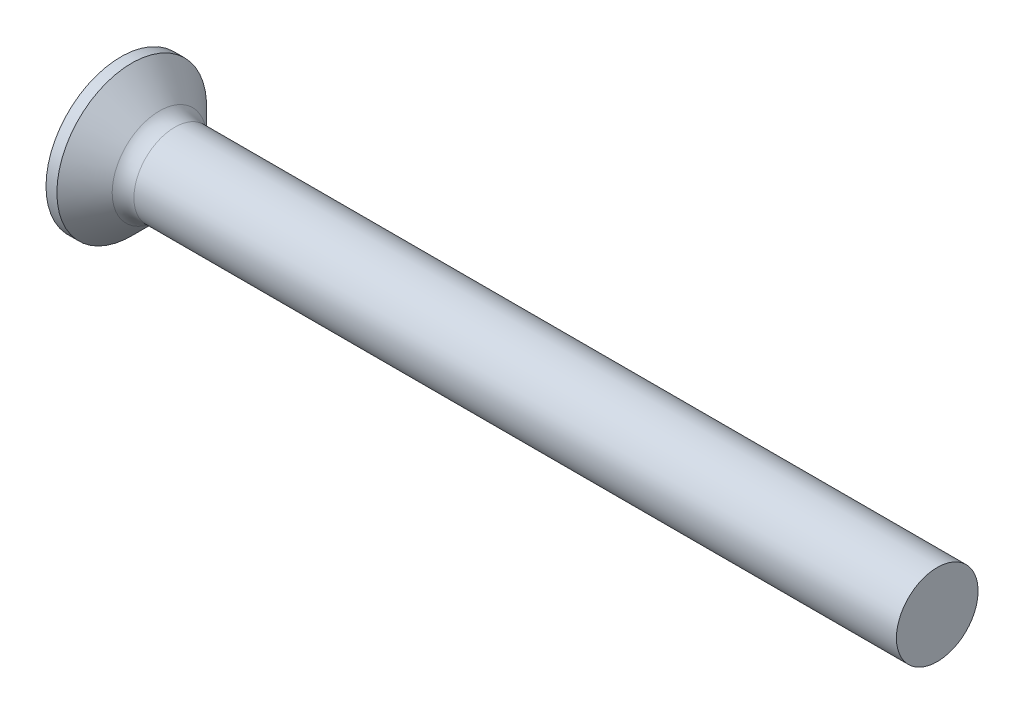
ISO-10303-21;
HEADER;
FILE_DESCRIPTION(('STEP AP214'),'2;1');
FILE_NAME('part.step','',(''),(''),'','','');
FILE_SCHEMA(('AUTOMOTIVE_DESIGN { 1 0 10303 214 1 1 1 1 }'));
ENDSEC;
DATA;
#1=APPLICATION_CONTEXT('core data for automotive mechanical design processes');
#2=APPLICATION_PROTOCOL_DEFINITION('international standard','automotive_design',2000,#1);
#3=PRODUCT_CONTEXT('',#1,'mechanical');
#4=PRODUCT('Part','Part','',(#3));
#5=PRODUCT_RELATED_PRODUCT_CATEGORY('part','',(#4));
#6=PRODUCT_DEFINITION_FORMATION('','',#4);
#7=PRODUCT_DEFINITION_CONTEXT('part definition',#1,'design');
#8=PRODUCT_DEFINITION('design','',#6,#7);
#9=PRODUCT_DEFINITION_SHAPE('','',#8);
#10=(LENGTH_UNIT() NAMED_UNIT(*) SI_UNIT(.MILLI.,.METRE.));
#11=(NAMED_UNIT(*) PLANE_ANGLE_UNIT() SI_UNIT($,.RADIAN.));
#12=(NAMED_UNIT(*) SI_UNIT($,.STERADIAN.) SOLID_ANGLE_UNIT());
#13=UNCERTAINTY_MEASURE_WITH_UNIT(LENGTH_MEASURE(1.E-05),#10,'distance_accuracy_value','');
#14=(GEOMETRIC_REPRESENTATION_CONTEXT(3) GLOBAL_UNCERTAINTY_ASSIGNED_CONTEXT((#13)) GLOBAL_UNIT_ASSIGNED_CONTEXT((#10,
#11,#12)) REPRESENTATION_CONTEXT('',''));
#15=CARTESIAN_POINT('',(0.,0.,0.));
#16=DIRECTION('',(0.,0.,1.));
#17=DIRECTION('',(1.,0.,0.));
#18=AXIS2_PLACEMENT_3D('',#15,#16,#17);
#19=CARTESIAN_POINT('',(2.01,-0.497851135403417,0.37));
#20=DIRECTION('',(0.,0.,-1.));
#21=DIRECTION('',(0.,1.,0.));
#22=AXIS2_PLACEMENT_3D('',#19,#20,#21);
#23=PLANE('',#22);
#24=DIRECTION('',(0.,-1.,0.));
#25=VECTOR('',#24,1.);
#26=CARTESIAN_POINT('',(0.,1.5,0.37));
#27=LINE('',#26,#25);
#28=CARTESIAN_POINT('',(0.,-0.590157547916263,0.37));
#29=VERTEX_POINT('',#28);
#30=CARTESIAN_POINT('',(0.,-1.5,0.37));
#31=VERTEX_POINT('',#30);
#32=EDGE_CURVE('E461',#29,#31,#27,.T.);
#33=ORIENTED_EDGE('',*,*,#32,.F.);
#34=CARTESIAN_POINT('',(-1.01053649691082,-0.672102030072118,0.37));
#35=CARTESIAN_POINT('',(-0.79970605871103,-0.655267098883947,0.37));
#36=CARTESIAN_POINT('',(-0.588886212503304,-0.638297110572311,0.37));
#37=CARTESIAN_POINT('',(-0.167272662529611,-0.603984130519828,0.37));
#38=CARTESIAN_POINT('',(0.0435210406290472,-0.586641131324258,0.37));
#39=CARTESIAN_POINT('',(0.465068838244709,-0.551479911667385,0.37));
#40=CARTESIAN_POINT('',(0.67582293271526,-0.533661691368909,0.37));
#41=CARTESIAN_POINT('',(1.09727362083221,-0.497387538872971,0.37));
#42=CARTESIAN_POINT('',(1.30797021521736,-0.478931615299089,0.37));
#43=CARTESIAN_POINT('',(1.67418894757201,-0.446067164121906,0.37));
#44=CARTESIAN_POINT('',(1.82972932585734,-0.431862501028414,0.37));
#45=CARTESIAN_POINT('',(2.14074770359484,-0.40279770973988,0.37));
#46=CARTESIAN_POINT('',(2.29622570356215,-0.38793758707517,0.37));
#47=CARTESIAN_POINT('',(2.60710169348415,-0.357305117937677,0.37));
#48=CARTESIAN_POINT('',(2.76249967840253,-0.34153271979064,0.37));
#49=CARTESIAN_POINT('',(2.99549070742189,-0.316847908281595,0.37));
#50=CARTESIAN_POINT('',(3.07313791118864,-0.308448465897182,0.37));
#51=CARTESIAN_POINT('',(3.22838341575769,-0.29120225104834,0.37));
#52=CARTESIAN_POINT('',(3.30598171599396,-0.282355473499083,0.37));
#53=CARTESIAN_POINT('',(3.38354828463398,-0.273232461289951,0.37));
#54=B_SPLINE_CURVE_WITH_KNOTS('',3,(#34,#35,#36,#37,#38,#39,#40,#41,#42,#43,#44,#45,#46,#47,#48,
#49,#50,#51,#52,#53),.UNSPECIFIED.,.F.,.F.,(4,2,2,2,2,2,2,2,2,4),(0.,0.634504777554397,
1.26902224766093,1.90353950036111,2.53804817592041,3.00661008438666,3.47516804019383,
3.94375256268972,4.17805198331268,4.41235406779909),.UNSPECIFIED.);
#55=CARTESIAN_POINT('',(2.01,-0.415013252800437,0.37));
#56=VERTEX_POINT('',#55);
#57=EDGE_CURVE('E222',#29,#56,#54,.T.);
#58=ORIENTED_EDGE('',*,*,#57,.T.);
#59=DIRECTION('',(0.,-1.,0.));
#60=VECTOR('',#59,1.);
#61=CARTESIAN_POINT('',(2.01,0.4978511354035,0.37));
#62=LINE('',#61,#60);
#63=CARTESIAN_POINT('',(2.01,-0.497851135403417,0.37));
#64=VERTEX_POINT('',#63);
#65=EDGE_CURVE('E372',#56,#64,#62,.T.);
#66=ORIENTED_EDGE('',*,*,#65,.T.);
#67=DIRECTION('',(0.894934391398435,0.446197753347451,0.));
#68=VECTOR('',#67,1.);
#69=CARTESIAN_POINT('',(0.,-1.5,0.37));
#70=LINE('',#69,#68);
#71=EDGE_CURVE('E475',#31,#64,#70,.T.);
#72=ORIENTED_EDGE('',*,*,#71,.F.);
#73=EDGE_LOOP('',(#33,#58,#66,#72));
#74=FACE_BOUND('',#73,.T.);
#75=ADVANCED_FACE('F41',(#74),#23,.T.);
#76=CARTESIAN_POINT('',(2.01,0.4978511354035,0.37));
#77=VERTEX_POINT('',#76);
#78=CARTESIAN_POINT('',(2.01,0.415013252800437,0.37));
#79=VERTEX_POINT('',#78);
#80=EDGE_CURVE('E369',#77,#79,#62,.T.);
#81=ORIENTED_EDGE('',*,*,#80,.T.);
#82=CARTESIAN_POINT('',(-1.01053649699026,0.672102030078459,0.37));
#83=CARTESIAN_POINT('',(-0.799706058781648,0.65526709888962,0.37));
#84=CARTESIAN_POINT('',(-0.588886212565099,0.638297110577309,0.37));
#85=CARTESIAN_POINT('',(-0.167272662573758,0.603984130523453,0.37));
#86=CARTESIAN_POINT('',(0.043521040593722,0.586641131327185,0.37));
#87=CARTESIAN_POINT('',(0.465068838236453,0.551479911668094,0.37));
#88=CARTESIAN_POINT('',(0.675822932725248,0.533661691368078,0.37));
#89=CARTESIAN_POINT('',(1.09727362087867,0.497387538868943,0.37));
#90=CARTESIAN_POINT('',(1.30797021528206,0.478931615293404,0.37));
#91=CARTESIAN_POINT('',(1.67418894765493,0.446067164114376,0.37));
#92=CARTESIAN_POINT('',(1.82972932594025,0.431862501020785,0.37));
#93=CARTESIAN_POINT('',(2.14074770367772,0.402797709732016,0.37));
#94=CARTESIAN_POINT('',(2.29622570364503,0.38793758706717,0.37));
#95=CARTESIAN_POINT('',(2.60710169356699,0.357305117929346,0.37));
#96=CARTESIAN_POINT('',(2.76249967848536,0.341532719782116,0.37));
#97=CARTESIAN_POINT('',(2.99549070750468,0.316847908272698,0.37));
#98=CARTESIAN_POINT('',(3.07313791127142,0.308448465888148,0.37));
#99=CARTESIAN_POINT('',(3.22838341584044,0.291202251038989,0.37));
#100=CARTESIAN_POINT('',(3.30598171607669,0.282355473489554,0.37));
#101=CARTESIAN_POINT('',(3.38354828471668,0.273232461280216,0.37));
#102=B_SPLINE_CURVE_WITH_KNOTS('',3,(#82,#83,#84,#85,#86,#87,#88,#89,#90,#91,#92,#93,#94,#95,
#96,#97,#98,#99,#100,#101),.UNSPECIFIED.,.F.,.F.,(4,2,2,2,2,2,2,2,2,4),(0.,0.634504777580945,
1.26902224771403,1.90353950046914,2.53804817608336,3.00661008454961,3.47516804035678,
3.94375256285268,4.17805198347564,4.41235406796206),.UNSPECIFIED.);
#103=CARTESIAN_POINT('',(0.,0.590157547916263,0.37));
#104=VERTEX_POINT('',#103);
#105=EDGE_CURVE('E214',#79,#104,#102,.F.);
#106=ORIENTED_EDGE('',*,*,#105,.T.);
#107=CARTESIAN_POINT('',(0.,1.5,0.37));
#108=VERTEX_POINT('',#107);
#109=EDGE_CURVE('E467',#108,#104,#27,.T.);
#110=ORIENTED_EDGE('',*,*,#109,.F.);
#111=DIRECTION('',(0.89493439139845,-0.446197753347421,0.));
#112=VECTOR('',#111,1.);
#113=CARTESIAN_POINT('',(0.,1.5,0.37));
#114=LINE('',#113,#112);
#115=EDGE_CURVE('E64',#108,#77,#114,.T.);
#116=ORIENTED_EDGE('',*,*,#115,.T.);
#117=EDGE_LOOP('',(#81,#106,#110,#116));
#118=FACE_BOUND('',#117,.T.);
#119=ADVANCED_FACE('F191',(#118),#23,.T.);
#120=CARTESIAN_POINT('',(2.01,0.4978511354035,-0.37));
#121=DIRECTION('',(0.,0.,1.));
#122=DIRECTION('',(1.,0.,0.));
#123=AXIS2_PLACEMENT_3D('',#120,#121,#122);
#124=PLANE('',#123);
#125=DIRECTION('',(0.,1.,0.));
#126=VECTOR('',#125,1.);
#127=CARTESIAN_POINT('',(2.01,-0.497851135403417,-0.37));
#128=LINE('',#127,#126);
#129=CARTESIAN_POINT('',(2.01,-0.497851135403417,-0.37));
#130=VERTEX_POINT('',#129);
#131=CARTESIAN_POINT('',(2.01,-0.415013252800437,-0.37));
#132=VERTEX_POINT('',#131);
#133=EDGE_CURVE('E384',#130,#132,#128,.T.);
#134=ORIENTED_EDGE('',*,*,#133,.T.);
#135=CARTESIAN_POINT('',(-1.01053649691082,-0.672102030072118,-0.37));
#136=CARTESIAN_POINT('',(-0.79970605871103,-0.655267098883947,-0.37));
#137=CARTESIAN_POINT('',(-0.588886212503305,-0.638297110572311,-0.37));
#138=CARTESIAN_POINT('',(-0.16727266252961,-0.603984130519828,-0.37));
#139=CARTESIAN_POINT('',(0.0435210406290472,-0.586641131324259,-0.37));
#140=CARTESIAN_POINT('',(0.465068838244709,-0.551479911667385,-0.37));
#141=CARTESIAN_POINT('',(0.67582293271526,-0.533661691368909,-0.37));
#142=CARTESIAN_POINT('',(1.09727362083221,-0.497387538872971,-0.37));
#143=CARTESIAN_POINT('',(1.30797021521736,-0.47893161529909,-0.37));
#144=CARTESIAN_POINT('',(1.67418894757201,-0.446067164121906,-0.37));
#145=CARTESIAN_POINT('',(1.82972932585734,-0.431862501028414,-0.37));
#146=CARTESIAN_POINT('',(2.14074770359484,-0.40279770973988,-0.37));
#147=CARTESIAN_POINT('',(2.29622570356215,-0.38793758707517,-0.37));
#148=CARTESIAN_POINT('',(2.60710169348415,-0.357305117937677,-0.37));
#149=CARTESIAN_POINT('',(2.76249967840254,-0.34153271979064,-0.37));
#150=CARTESIAN_POINT('',(2.99549070742189,-0.316847908281595,-0.37));
#151=CARTESIAN_POINT('',(3.07313791118864,-0.308448465897182,-0.37));
#152=CARTESIAN_POINT('',(3.22838341575769,-0.29120225104834,-0.37));
#153=CARTESIAN_POINT('',(3.30598171599396,-0.282355473499083,-0.37));
#154=CARTESIAN_POINT('',(3.38354828463398,-0.273232461289951,-0.37));
#155=B_SPLINE_CURVE_WITH_KNOTS('',3,(#135,#136,#137,#138,#139,#140,#141,#142,#143,#144,#145,
#146,#147,#148,#149,#150,#151,#152,#153,#154),.UNSPECIFIED.,.F.,.F.,(4,2,2,2,2,2,2,2,2,4),(0.,
0.634504777554397,1.26902224766093,1.90353950036111,2.53804817592041,3.00661008438666,
3.47516804019383,3.94375256268973,4.17805198331268,4.41235406779909),.UNSPECIFIED.);
#156=CARTESIAN_POINT('',(0.,-0.590157547916263,-0.37));
#157=VERTEX_POINT('',#156);
#158=EDGE_CURVE('E280',#132,#157,#155,.F.);
#159=ORIENTED_EDGE('',*,*,#158,.T.);
#160=DIRECTION('',(0.,1.,0.));
#161=VECTOR('',#160,1.);
#162=CARTESIAN_POINT('',(0.,-1.5,-0.37));
#163=LINE('',#162,#161);
#164=CARTESIAN_POINT('',(0.,-1.5,-0.37));
#165=VERTEX_POINT('',#164);
#166=EDGE_CURVE('E463',#165,#157,#163,.T.);
#167=ORIENTED_EDGE('',*,*,#166,.F.);
#168=DIRECTION('',(0.894934391398435,0.446197753347451,0.));
#169=VECTOR('',#168,1.);
#170=CARTESIAN_POINT('',(0.,-1.5,-0.37));
#171=LINE('',#170,#169);
#172=EDGE_CURVE('E471',#165,#130,#171,.T.);
#173=ORIENTED_EDGE('',*,*,#172,.T.);
#174=EDGE_LOOP('',(#134,#159,#167,#173));
#175=FACE_BOUND('',#174,.T.);
#176=ADVANCED_FACE('F205',(#175),#124,.T.);
#177=CARTESIAN_POINT('',(0.,0.590157547916263,-0.37));
#178=VERTEX_POINT('',#177);
#179=CARTESIAN_POINT('',(0.,1.5,-0.37));
#180=VERTEX_POINT('',#179);
#181=EDGE_CURVE('E472',#178,#180,#163,.T.);
#182=ORIENTED_EDGE('',*,*,#181,.F.);
#183=CARTESIAN_POINT('',(-1.01053649691082,0.672102030072118,-0.37));
#184=CARTESIAN_POINT('',(-0.79970605871103,0.655267098883947,-0.37));
#185=CARTESIAN_POINT('',(-0.588886212503304,0.638297110572311,-0.37));
#186=CARTESIAN_POINT('',(-0.16727266252961,0.603984130519828,-0.37));
#187=CARTESIAN_POINT('',(0.0435210406290473,0.586641131324259,-0.37));
#188=CARTESIAN_POINT('',(0.465068838244709,0.551479911667385,-0.37));
#189=CARTESIAN_POINT('',(0.67582293271526,0.533661691368909,-0.37));
#190=CARTESIAN_POINT('',(1.09727362083221,0.497387538872971,-0.37));
#191=CARTESIAN_POINT('',(1.30797021521736,0.478931615299089,-0.37));
#192=CARTESIAN_POINT('',(1.67418894757201,0.446067164121906,-0.37));
#193=CARTESIAN_POINT('',(1.82972932585734,0.431862501028415,-0.37));
#194=CARTESIAN_POINT('',(2.14074770359484,0.40279770973988,-0.37));
#195=CARTESIAN_POINT('',(2.29622570356215,0.38793758707517,-0.37));
#196=CARTESIAN_POINT('',(2.60710169348415,0.357305117937677,-0.37));
#197=CARTESIAN_POINT('',(2.76249967840253,0.34153271979064,-0.37));
#198=CARTESIAN_POINT('',(2.99549070742189,0.316847908281595,-0.37));
#199=CARTESIAN_POINT('',(3.07313791118864,0.308448465897183,-0.37));
#200=CARTESIAN_POINT('',(3.22838341575769,0.29120225104834,-0.37));
#201=CARTESIAN_POINT('',(3.30598171599396,0.282355473499083,-0.37));
#202=CARTESIAN_POINT('',(3.38354828463398,0.273232461289951,-0.37));
#203=B_SPLINE_CURVE_WITH_KNOTS('',3,(#183,#184,#185,#186,#187,#188,#189,#190,#191,#192,#193,
#194,#195,#196,#197,#198,#199,#200,#201,#202),.UNSPECIFIED.,.F.,.F.,(4,2,2,2,2,2,2,2,2,4),(0.,
0.634504777554397,1.26902224766093,1.90353950036111,2.53804817592041,3.00661008438666,
3.47516804019383,3.94375256268972,4.17805198331267,4.41235406779909),.UNSPECIFIED.);
#204=CARTESIAN_POINT('',(2.01,0.415013252800437,-0.37));
#205=VERTEX_POINT('',#204);
#206=EDGE_CURVE('E272',#178,#205,#203,.T.);
#207=ORIENTED_EDGE('',*,*,#206,.T.);
#208=CARTESIAN_POINT('',(2.01,0.4978511354035,-0.37));
#209=VERTEX_POINT('',#208);
#210=EDGE_CURVE('E383',#205,#209,#128,.T.);
#211=ORIENTED_EDGE('',*,*,#210,.T.);
#212=DIRECTION('',(0.89493439139845,-0.446197753347421,0.));
#213=VECTOR('',#212,1.);
#214=CARTESIAN_POINT('',(0.,1.5,-0.37));
#215=LINE('',#214,#213);
#216=EDGE_CURVE('E385',#180,#209,#215,.T.);
#217=ORIENTED_EDGE('',*,*,#216,.F.);
#218=EDGE_LOOP('',(#182,#207,#211,#217));
#219=FACE_BOUND('',#218,.T.);
#220=ADVANCED_FACE('F485',(#219),#124,.T.);
#221=CARTESIAN_POINT('',(2.01,0.4978511354035,-0.37));
#222=DIRECTION('',(1.,0.,0.));
#223=DIRECTION('',(0.,0.,-1.));
#224=AXIS2_PLACEMENT_3D('',#221,#222,#223);
#225=PLANE('',#224);
#226=CARTESIAN_POINT('',(2.01,0.,0.));
#227=DIRECTION('',(-1.,0.,0.));
#228=DIRECTION('',(0.,0.,1.));
#229=AXIS2_PLACEMENT_3D('',#226,#227,#228);
#230=CIRCLE('',#229,0.555999999999999);
#231=CARTESIAN_POINT('',(2.01,-0.247548473995554,-0.497851135403418));
#232=VERTEX_POINT('',#231);
#233=CARTESIAN_POINT('',(2.01,-0.369999999999999,-0.415013252800438));
#234=VERTEX_POINT('',#233);
#235=EDGE_CURVE('E346',#232,#234,#230,.T.);
#236=ORIENTED_EDGE('',*,*,#235,.F.);
#237=DIRECTION('',(0.,1.,0.));
#238=VECTOR('',#237,1.);
#239=CARTESIAN_POINT('',(2.01,-0.369999999999998,-0.497851135403418));
#240=LINE('',#239,#238);
#241=CARTESIAN_POINT('',(2.01,-0.369999999999998,-0.497851135403418));
#242=VERTEX_POINT('',#241);
#243=EDGE_CURVE('E446',#242,#232,#240,.T.);
#244=ORIENTED_EDGE('',*,*,#243,.F.);
#245=DIRECTION('',(0.,0.,-1.));
#246=VECTOR('',#245,1.);
#247=CARTESIAN_POINT('',(2.01,-0.370000000000002,0.497851135403499));
#248=LINE('',#247,#246);
#249=EDGE_CURVE('E453',#234,#242,#248,.T.);
#250=ORIENTED_EDGE('',*,*,#249,.F.);
#251=EDGE_LOOP('',(#236,#244,#250));
#252=FACE_BOUND('',#251,.T.);
#253=ADVANCED_FACE('F492',(#252),#225,.F.);
#254=CARTESIAN_POINT('',(2.01,-0.497851135403417,-0.247548473995555));
#255=VERTEX_POINT('',#254);
#256=EDGE_CURVE('E344',#132,#255,#230,.T.);
#257=ORIENTED_EDGE('',*,*,#256,.F.);
#258=ORIENTED_EDGE('',*,*,#133,.F.);
#259=DIRECTION('',(0.,0.,-1.));
#260=VECTOR('',#259,1.);
#261=CARTESIAN_POINT('',(2.01,-0.497851135403417,0.37));
#262=LINE('',#261,#260);
#263=EDGE_CURVE('E373',#255,#130,#262,.T.);
#264=ORIENTED_EDGE('',*,*,#263,.F.);
#265=EDGE_LOOP('',(#257,#258,#264));
#266=FACE_BOUND('',#265,.T.);
#267=ADVANCED_FACE('F501',(#266),#225,.F.);
#268=CARTESIAN_POINT('',(2.01,-0.497851135403417,0.247548473995555));
#269=VERTEX_POINT('',#268);
#270=EDGE_CURVE('E339',#269,#56,#230,.T.);
#271=ORIENTED_EDGE('',*,*,#270,.F.);
#272=EDGE_CURVE('E376',#64,#269,#262,.T.);
#273=ORIENTED_EDGE('',*,*,#272,.F.);
#274=ORIENTED_EDGE('',*,*,#65,.F.);
#275=EDGE_LOOP('',(#271,#273,#274));
#276=FACE_BOUND('',#275,.T.);
#277=ADVANCED_FACE('F510',(#276),#225,.F.);
#278=CARTESIAN_POINT('',(2.01,-0.370000000000001,0.415013252800436));
#279=VERTEX_POINT('',#278);
#280=CARTESIAN_POINT('',(2.01,-0.24754847399539,0.497851135403499));
#281=VERTEX_POINT('',#280);
#282=EDGE_CURVE('E57',#279,#281,#230,.T.);
#283=ORIENTED_EDGE('',*,*,#282,.F.);
#284=CARTESIAN_POINT('',(2.01,-0.370000000000002,0.497851135403499));
#285=VERTEX_POINT('',#284);
#286=EDGE_CURVE('E451',#285,#279,#248,.T.);
#287=ORIENTED_EDGE('',*,*,#286,.F.);
#288=DIRECTION('',(0.,-1.,0.));
#289=VECTOR('',#288,1.);
#290=CARTESIAN_POINT('',(2.01,0.369999999999998,0.497851135403501));
#291=LINE('',#290,#289);
#292=EDGE_CURVE('E454',#281,#285,#291,.T.);
#293=ORIENTED_EDGE('',*,*,#292,.F.);
#294=EDGE_LOOP('',(#283,#287,#293));
#295=FACE_BOUND('',#294,.T.);
#296=ADVANCED_FACE('F534',(#295),#225,.F.);
#297=CARTESIAN_POINT('',(2.01,0.247548473995386,0.497851135403501));
#298=VERTEX_POINT('',#297);
#299=CARTESIAN_POINT('',(2.01,0.369999999999999,0.415013252800438));
#300=VERTEX_POINT('',#299);
#301=EDGE_CURVE('E328',#298,#300,#230,.T.);
#302=ORIENTED_EDGE('',*,*,#301,.F.);
#303=CARTESIAN_POINT('',(2.01,0.369999999999998,0.497851135403501));
#304=VERTEX_POINT('',#303);
#305=EDGE_CURVE('E448',#304,#298,#291,.T.);
#306=ORIENTED_EDGE('',*,*,#305,.F.);
#307=DIRECTION('',(0.,0.,1.));
#308=VECTOR('',#307,1.);
#309=CARTESIAN_POINT('',(2.01,0.370000000000002,-0.497851135403416));
#310=LINE('',#309,#308);
#311=EDGE_CURVE('E226',#300,#304,#310,.T.);
#312=ORIENTED_EDGE('',*,*,#311,.F.);
#313=EDGE_LOOP('',(#302,#306,#312));
#314=FACE_BOUND('',#313,.T.);
#315=ADVANCED_FACE('F493',(#314),#225,.F.);
#316=CARTESIAN_POINT('',(2.01,0.4978511354035,0.247548473995388));
#317=VERTEX_POINT('',#316);
#318=EDGE_CURVE('E340',#79,#317,#230,.T.);
#319=ORIENTED_EDGE('',*,*,#318,.F.);
#320=ORIENTED_EDGE('',*,*,#80,.F.);
#321=DIRECTION('',(0.,0.,1.));
#322=VECTOR('',#321,1.);
#323=CARTESIAN_POINT('',(2.01,0.4978511354035,-0.37));
#324=LINE('',#323,#322);
#325=EDGE_CURVE('E371',#317,#77,#324,.T.);
#326=ORIENTED_EDGE('',*,*,#325,.F.);
#327=EDGE_LOOP('',(#319,#320,#326));
#328=FACE_BOUND('',#327,.T.);
#329=ADVANCED_FACE('F367',(#328),#225,.F.);
#330=CARTESIAN_POINT('',(2.01,0.4978511354035,-0.247548473995388));
#331=VERTEX_POINT('',#330);
#332=EDGE_CURVE('E360',#331,#205,#230,.T.);
#333=ORIENTED_EDGE('',*,*,#332,.F.);
#334=EDGE_CURVE('E377',#209,#331,#324,.T.);
#335=ORIENTED_EDGE('',*,*,#334,.F.);
#336=ORIENTED_EDGE('',*,*,#210,.F.);
#337=EDGE_LOOP('',(#333,#335,#336));
#338=FACE_BOUND('',#337,.T.);
#339=ADVANCED_FACE('F481',(#338),#225,.F.);
#340=CARTESIAN_POINT('',(2.01,-0.497851135403417,-0.37));
#341=DIRECTION('',(-0.446197753347451,0.894934391398435,0.));
#342=DIRECTION('',(-0.894934391398435,-0.446197753347451,0.));
#343=AXIS2_PLACEMENT_3D('',#340,#341,#342);
#344=PLANE('',#343);
#345=ORIENTED_EDGE('',*,*,#272,.T.);
#346=CARTESIAN_POINT('',(2.86902919914407,-0.0695550475538948,0.));
#347=DIRECTION('',(-0.446197753347451,0.894934391398435,0.));
#348=DIRECTION('',(-0.894934391398435,-0.446197753347451,0.));
#349=AXIS2_PLACEMENT_3D('',#346,#347,#348);
#350=ELLIPSE('',#349,1.11145971268775,0.491029001453367);
#351=EDGE_CURVE('E286',#269,#255,#350,.F.);
#352=ORIENTED_EDGE('',*,*,#351,.T.);
#353=ORIENTED_EDGE('',*,*,#263,.T.);
#354=ORIENTED_EDGE('',*,*,#172,.F.);
#355=DIRECTION('',(0.,0.,-1.));
#356=VECTOR('',#355,1.);
#357=CARTESIAN_POINT('',(0.,-1.5,0.37));
#358=LINE('',#357,#356);
#359=EDGE_CURVE('E386',#31,#165,#358,.T.);
#360=ORIENTED_EDGE('',*,*,#359,.F.);
#361=ORIENTED_EDGE('',*,*,#71,.T.);
#362=EDGE_LOOP('',(#345,#352,#353,#354,#360,#361));
#363=FACE_BOUND('',#362,.T.);
#364=ADVANCED_FACE('F206',(#363),#344,.T.);
#365=CARTESIAN_POINT('',(2.01,0.4978511354035,0.37));
#366=DIRECTION('',(-0.446197753347421,-0.89493439139845,0.));
#367=DIRECTION('',(0.89493439139845,-0.446197753347421,0.));
#368=AXIS2_PLACEMENT_3D('',#365,#366,#367);
#369=PLANE('',#368);
#370=ORIENTED_EDGE('',*,*,#334,.T.);
#371=CARTESIAN_POINT('',(2.8690291991443,0.069555047553898,0.));
#372=DIRECTION('',(-0.446197753347421,-0.89493439139845,0.));
#373=DIRECTION('',(-0.89493439139845,0.446197753347421,0.));
#374=AXIS2_PLACEMENT_3D('',#371,#372,#373);
#375=ELLIPSE('',#374,1.11145971268778,0.49102900145335);
#376=EDGE_CURVE('E295',#331,#317,#375,.F.);
#377=ORIENTED_EDGE('',*,*,#376,.T.);
#378=ORIENTED_EDGE('',*,*,#325,.T.);
#379=ORIENTED_EDGE('',*,*,#115,.F.);
#380=DIRECTION('',(0.,0.,1.));
#381=VECTOR('',#380,1.);
#382=CARTESIAN_POINT('',(0.,1.5,-0.37));
#383=LINE('',#382,#381);
#384=EDGE_CURVE('E462',#180,#108,#383,.T.);
#385=ORIENTED_EDGE('',*,*,#384,.F.);
#386=ORIENTED_EDGE('',*,*,#216,.T.);
#387=EDGE_LOOP('',(#370,#377,#378,#379,#385,#386));
#388=FACE_BOUND('',#387,.T.);
#389=ADVANCED_FACE('F478',(#388),#369,.T.);
#390=CARTESIAN_POINT('',(2.01,0.369999999999998,0.497851135403501));
#391=DIRECTION('',(0.,-1.,0.));
#392=DIRECTION('',(1.,0.,0.));
#393=AXIS2_PLACEMENT_3D('',#390,#391,#392);
#394=PLANE('',#393);
#395=CARTESIAN_POINT('',(2.01,0.370000000000002,-0.497851135403416));
#396=VERTEX_POINT('',#395);
#397=CARTESIAN_POINT('',(2.01,0.370000000000001,-0.415013252800436));
#398=VERTEX_POINT('',#397);
#399=EDGE_CURVE('E456',#396,#398,#310,.T.);
#400=ORIENTED_EDGE('',*,*,#399,.T.);
#401=CARTESIAN_POINT('',(-1.01053649699026,0.370000000000002,-0.672102030078458));
#402=CARTESIAN_POINT('',(-0.799706058781648,0.370000000000002,-0.655267098889619));
#403=CARTESIAN_POINT('',(-0.588886212565099,0.370000000000002,-0.638297110577308));
#404=CARTESIAN_POINT('',(-0.167272662573758,0.370000000000002,-0.603984130523452));
#405=CARTESIAN_POINT('',(0.0435210405937218,0.370000000000002,-0.586641131327184));
#406=CARTESIAN_POINT('',(0.465068838236452,0.370000000000002,-0.551479911668093));
#407=CARTESIAN_POINT('',(0.675822932725247,0.370000000000002,-0.533661691368077));
#408=CARTESIAN_POINT('',(1.09727362087867,0.370000000000002,-0.497387538868942));
#409=CARTESIAN_POINT('',(1.30797021528206,0.370000000000002,-0.478931615293403));
#410=CARTESIAN_POINT('',(1.67418894765493,0.370000000000001,-0.446067164114375));
#411=CARTESIAN_POINT('',(1.82972932594025,0.370000000000001,-0.431862501020784));
#412=CARTESIAN_POINT('',(2.14074770367772,0.370000000000001,-0.402797709732014));
#413=CARTESIAN_POINT('',(2.29622570364503,0.370000000000001,-0.387937587067169));
#414=CARTESIAN_POINT('',(2.60710169356699,0.370000000000001,-0.357305117929345));
#415=CARTESIAN_POINT('',(2.76249967848536,0.370000000000001,-0.341532719782114));
#416=CARTESIAN_POINT('',(2.99549070750468,0.370000000000001,-0.316847908272697));
#417=CARTESIAN_POINT('',(3.07313791127142,0.370000000000001,-0.308448465888147));
#418=CARTESIAN_POINT('',(3.22838341584044,0.370000000000001,-0.291202251038988));
#419=CARTESIAN_POINT('',(3.30598171607669,0.370000000000001,-0.282355473489552));
#420=CARTESIAN_POINT('',(3.38354828471668,0.370000000000001,-0.273232461280215));
#421=B_SPLINE_CURVE_WITH_KNOTS('',3,(#401,#402,#403,#404,#405,#406,#407,#408,#409,#410,#411,
#412,#413,#414,#415,#416,#417,#418,#419,#420),.UNSPECIFIED.,.F.,.F.,(4,2,2,2,2,2,2,2,2,4),(0.,
0.634504777580945,1.26902224771403,1.90353950046914,2.53804817608336,3.00661008454961,
3.47516804035678,3.94375256285268,4.17805198347564,4.41235406796206),.UNSPECIFIED.);
#422=CARTESIAN_POINT('',(0.,0.370000000000002,-0.590157547916262));
#423=VERTEX_POINT('',#422);
#424=EDGE_CURVE('E264',#398,#423,#421,.F.);
#425=ORIENTED_EDGE('',*,*,#424,.T.);
#426=DIRECTION('',(0.,0.,1.));
#427=VECTOR('',#426,1.);
#428=CARTESIAN_POINT('',(0.,0.370000000000005,-1.5));
#429=LINE('',#428,#427);
#430=CARTESIAN_POINT('',(0.,0.370000000000005,-1.5));
#431=VERTEX_POINT('',#430);
#432=EDGE_CURVE('E434',#431,#423,#429,.T.);
#433=ORIENTED_EDGE('',*,*,#432,.F.);
#434=DIRECTION('',(0.894934391398435,0.,0.446197753347451));
#435=VECTOR('',#434,1.);
#436=CARTESIAN_POINT('',(0.,0.370000000000005,-1.5));
#437=LINE('',#436,#435);
#438=EDGE_CURVE('E441',#431,#396,#437,.T.);
#439=ORIENTED_EDGE('',*,*,#438,.T.);
#440=EDGE_LOOP('',(#400,#425,#433,#439));
#441=FACE_BOUND('',#440,.T.);
#442=ADVANCED_FACE('F613',(#441),#394,.T.);
#443=CARTESIAN_POINT('',(2.01,-0.369999999999998,-0.497851135403418));
#444=DIRECTION('',(0.,1.,0.));
#445=DIRECTION('',(0.,0.,1.));
#446=AXIS2_PLACEMENT_3D('',#443,#444,#445);
#447=PLANE('',#446);
#448=DIRECTION('',(0.,0.,-1.));
#449=VECTOR('',#448,1.);
#450=CARTESIAN_POINT('',(0.,-0.370000000000005,1.5));
#451=LINE('',#450,#449);
#452=CARTESIAN_POINT('',(0.,-0.369999999999998,-0.590157547916264));
#453=VERTEX_POINT('',#452);
#454=CARTESIAN_POINT('',(0.,-0.369999999999995,-1.5));
#455=VERTEX_POINT('',#454);
#456=EDGE_CURVE('E431',#453,#455,#451,.T.);
#457=ORIENTED_EDGE('',*,*,#456,.F.);
#458=CARTESIAN_POINT('',(-1.01053649699026,-0.369999999999998,-0.67210203007846));
#459=CARTESIAN_POINT('',(-0.799706058781648,-0.369999999999998,-0.655267098889622));
#460=CARTESIAN_POINT('',(-0.588886212565099,-0.369999999999998,-0.638297110577311));
#461=CARTESIAN_POINT('',(-0.167272662573759,-0.369999999999998,-0.603984130523454));
#462=CARTESIAN_POINT('',(0.0435210405937218,-0.369999999999998,-0.586641131327186));
#463=CARTESIAN_POINT('',(0.465068838236453,-0.369999999999998,-0.551479911668095));
#464=CARTESIAN_POINT('',(0.675822932725248,-0.369999999999998,-0.53366169136808));
#465=CARTESIAN_POINT('',(1.09727362087867,-0.369999999999998,-0.497387538868944));
#466=CARTESIAN_POINT('',(1.30797021528206,-0.369999999999998,-0.478931615293405));
#467=CARTESIAN_POINT('',(1.67418894765493,-0.369999999999999,-0.446067164114377));
#468=CARTESIAN_POINT('',(1.82972932594025,-0.369999999999999,-0.431862501020786));
#469=CARTESIAN_POINT('',(2.14074770367772,-0.369999999999999,-0.402797709732017));
#470=CARTESIAN_POINT('',(2.29622570364503,-0.369999999999999,-0.387937587067171));
#471=CARTESIAN_POINT('',(2.60710169356699,-0.369999999999999,-0.357305117929348));
#472=CARTESIAN_POINT('',(2.76249967848536,-0.369999999999999,-0.341532719782117));
#473=CARTESIAN_POINT('',(2.99549070750468,-0.369999999999999,-0.316847908272699));
#474=CARTESIAN_POINT('',(3.07313791127142,-0.369999999999999,-0.30844846588815));
#475=CARTESIAN_POINT('',(3.22838341584044,-0.369999999999999,-0.291202251038991));
#476=CARTESIAN_POINT('',(3.30598171607669,-0.369999999999999,-0.282355473489555));
#477=CARTESIAN_POINT('',(3.38354828471668,-0.369999999999999,-0.273232461280217));
#478=B_SPLINE_CURVE_WITH_KNOTS('',3,(#458,#459,#460,#461,#462,#463,#464,#465,#466,#467,#468,
#469,#470,#471,#472,#473,#474,#475,#476,#477),.UNSPECIFIED.,.F.,.F.,(4,2,2,2,2,2,2,2,2,4),(0.,
0.634504777580943,1.26902224771403,1.90353950046914,2.53804817608336,3.00661008454961,
3.47516804035678,3.94375256285268,4.17805198347564,4.41235406796206),.UNSPECIFIED.);
#479=EDGE_CURVE('E257',#453,#234,#478,.T.);
#480=ORIENTED_EDGE('',*,*,#479,.T.);
#481=ORIENTED_EDGE('',*,*,#249,.T.);
#482=DIRECTION('',(0.894934391398435,0.,0.446197753347451));
#483=VECTOR('',#482,1.);
#484=CARTESIAN_POINT('',(0.,-0.369999999999995,-1.5));
#485=LINE('',#484,#483);
#486=EDGE_CURVE('E438',#455,#242,#485,.T.);
#487=ORIENTED_EDGE('',*,*,#486,.F.);
#488=EDGE_LOOP('',(#457,#480,#481,#487));
#489=FACE_BOUND('',#488,.T.);
#490=ADVANCED_FACE('F515',(#489),#447,.T.);
#491=CARTESIAN_POINT('',(2.01,0.370000000000002,-0.497851135403416));
#492=DIRECTION('',(-0.446197753347451,0.,0.894934391398435));
#493=DIRECTION('',(-0.894934391398435,0.,-0.446197753347451));
#494=AXIS2_PLACEMENT_3D('',#491,#492,#493);
#495=PLANE('',#494);
#496=ORIENTED_EDGE('',*,*,#243,.T.);
#497=CARTESIAN_POINT('',(2.86902919914407,0.,-0.0695550475538948));
#498=DIRECTION('',(-0.446197753347451,0.,0.894934391398435));
#499=DIRECTION('',(-0.894934391398435,0.,-0.446197753347451));
#500=AXIS2_PLACEMENT_3D('',#497,#498,#499);
#501=ELLIPSE('',#500,1.11145971268775,0.491029001453367);
#502=CARTESIAN_POINT('',(2.01,0.247548473995557,-0.497851135403416));
#503=VERTEX_POINT('',#502);
#504=EDGE_CURVE('E310',#232,#503,#501,.F.);
#505=ORIENTED_EDGE('',*,*,#504,.T.);
#506=EDGE_CURVE('E460',#503,#396,#240,.T.);
#507=ORIENTED_EDGE('',*,*,#506,.T.);
#508=ORIENTED_EDGE('',*,*,#438,.F.);
#509=DIRECTION('',(0.,1.,0.));
#510=VECTOR('',#509,1.);
#511=CARTESIAN_POINT('',(0.,-0.369999999999995,-1.5));
#512=LINE('',#511,#510);
#513=EDGE_CURVE('E427',#455,#431,#512,.T.);
#514=ORIENTED_EDGE('',*,*,#513,.F.);
#515=ORIENTED_EDGE('',*,*,#486,.T.);
#516=EDGE_LOOP('',(#496,#505,#507,#508,#514,#515));
#517=FACE_BOUND('',#516,.T.);
#518=ADVANCED_FACE('F231',(#517),#495,.T.);
#519=ORIENTED_EDGE('',*,*,#286,.T.);
#520=CARTESIAN_POINT('',(-1.01053649699026,-0.370000000000002,0.672102030078458));
#521=CARTESIAN_POINT('',(-0.799706058781648,-0.370000000000002,0.655267098889619));
#522=CARTESIAN_POINT('',(-0.588886212565099,-0.370000000000002,0.638297110577308));
#523=CARTESIAN_POINT('',(-0.167272662573758,-0.370000000000002,0.603984130523451));
#524=CARTESIAN_POINT('',(0.0435210405937218,-0.370000000000002,0.586641131327183));
#525=CARTESIAN_POINT('',(0.465068838236452,-0.370000000000002,0.551479911668093));
#526=CARTESIAN_POINT('',(0.675822932725247,-0.370000000000002,0.533661691368077));
#527=CARTESIAN_POINT('',(1.09727362087867,-0.370000000000002,0.497387538868942));
#528=CARTESIAN_POINT('',(1.30797021528206,-0.370000000000002,0.478931615293403));
#529=CARTESIAN_POINT('',(1.67418894765493,-0.370000000000002,0.446067164114375));
#530=CARTESIAN_POINT('',(1.82972932594025,-0.370000000000001,0.431862501020784));
#531=CARTESIAN_POINT('',(2.14074770367772,-0.370000000000001,0.402797709732014));
#532=CARTESIAN_POINT('',(2.29622570364503,-0.370000000000001,0.387937587067169));
#533=CARTESIAN_POINT('',(2.60710169356699,-0.370000000000001,0.357305117929345));
#534=CARTESIAN_POINT('',(2.76249967848536,-0.370000000000001,0.341532719782114));
#535=CARTESIAN_POINT('',(2.99549070750468,-0.370000000000001,0.316847908272697));
#536=CARTESIAN_POINT('',(3.07313791127142,-0.370000000000001,0.308448465888147));
#537=CARTESIAN_POINT('',(3.22838341584044,-0.370000000000001,0.291202251038988));
#538=CARTESIAN_POINT('',(3.30598171607669,-0.370000000000001,0.282355473489552));
#539=CARTESIAN_POINT('',(3.38354828471668,-0.370000000000001,0.273232461280214));
#540=B_SPLINE_CURVE_WITH_KNOTS('',3,(#520,#521,#522,#523,#524,#525,#526,#527,#528,#529,#530,
#531,#532,#533,#534,#535,#536,#537,#538,#539),.UNSPECIFIED.,.F.,.F.,(4,2,2,2,2,2,2,2,2,4),(0.,
0.634504777580945,1.26902224771403,1.90353950046914,2.53804817608336,3.00661008454961,
3.47516804035678,3.94375256285268,4.17805198347564,4.41235406796206),.UNSPECIFIED.);
#541=CARTESIAN_POINT('',(0.,-0.370000000000002,0.590157547916262));
#542=VERTEX_POINT('',#541);
#543=EDGE_CURVE('E247',#279,#542,#540,.F.);
#544=ORIENTED_EDGE('',*,*,#543,.T.);
#545=CARTESIAN_POINT('',(0.,-0.370000000000005,1.5));
#546=VERTEX_POINT('',#545);
#547=EDGE_CURVE('E428',#546,#542,#451,.T.);
#548=ORIENTED_EDGE('',*,*,#547,.F.);
#549=DIRECTION('',(0.89493439139845,0.,-0.446197753347421));
#550=VECTOR('',#549,1.);
#551=CARTESIAN_POINT('',(0.,-0.370000000000005,1.5));
#552=LINE('',#551,#550);
#553=EDGE_CURVE('E443',#546,#285,#552,.T.);
#554=ORIENTED_EDGE('',*,*,#553,.T.);
#555=EDGE_LOOP('',(#519,#544,#548,#554));
#556=FACE_BOUND('',#555,.T.);
#557=ADVANCED_FACE('F535',(#556),#447,.T.);
#558=CARTESIAN_POINT('',(0.,0.369999999999998,0.590157547916264));
#559=VERTEX_POINT('',#558);
#560=CARTESIAN_POINT('',(0.,0.369999999999995,1.5));
#561=VERTEX_POINT('',#560);
#562=EDGE_CURVE('E440',#559,#561,#429,.T.);
#563=ORIENTED_EDGE('',*,*,#562,.F.);
#564=CARTESIAN_POINT('',(-1.01053649699026,0.369999999999997,0.67210203007846));
#565=CARTESIAN_POINT('',(-0.799706058781648,0.369999999999998,0.655267098889622));
#566=CARTESIAN_POINT('',(-0.588886212565098,0.369999999999998,0.638297110577311));
#567=CARTESIAN_POINT('',(-0.167272662573758,0.369999999999998,0.603984130523454));
#568=CARTESIAN_POINT('',(0.043521040593722,0.369999999999998,0.586641131327186));
#569=CARTESIAN_POINT('',(0.465068838236453,0.369999999999998,0.551479911668095));
#570=CARTESIAN_POINT('',(0.675822932725248,0.369999999999998,0.53366169136808));
#571=CARTESIAN_POINT('',(1.09727362087867,0.369999999999998,0.497387538868944));
#572=CARTESIAN_POINT('',(1.30797021528206,0.369999999999998,0.478931615293405));
#573=CARTESIAN_POINT('',(1.67418894765493,0.369999999999998,0.446067164114377));
#574=CARTESIAN_POINT('',(1.82972932594025,0.369999999999998,0.431862501020787));
#575=CARTESIAN_POINT('',(2.14074770367772,0.369999999999999,0.402797709732017));
#576=CARTESIAN_POINT('',(2.29622570364503,0.369999999999999,0.387937587067171));
#577=CARTESIAN_POINT('',(2.60710169356699,0.369999999999999,0.357305117929348));
#578=CARTESIAN_POINT('',(2.76249967848536,0.369999999999999,0.341532719782117));
#579=CARTESIAN_POINT('',(2.99549070750468,0.369999999999999,0.3168479082727));
#580=CARTESIAN_POINT('',(3.07313791127142,0.369999999999999,0.30844846588815));
#581=CARTESIAN_POINT('',(3.22838341584044,0.369999999999999,0.291202251038991));
#582=CARTESIAN_POINT('',(3.30598171607669,0.369999999999999,0.282355473489555));
#583=CARTESIAN_POINT('',(3.38354828471668,0.369999999999999,0.273232461280217));
#584=B_SPLINE_CURVE_WITH_KNOTS('',3,(#564,#565,#566,#567,#568,#569,#570,#571,#572,#573,#574,
#575,#576,#577,#578,#579,#580,#581,#582,#583),.UNSPECIFIED.,.F.,.F.,(4,2,2,2,2,2,2,2,2,4),(0.,
0.634504777580945,1.26902224771403,1.90353950046914,2.53804817608336,3.00661008454961,
3.47516804035678,3.94375256285268,4.17805198347564,4.41235406796206),.UNSPECIFIED.);
#585=EDGE_CURVE('E238',#559,#300,#584,.T.);
#586=ORIENTED_EDGE('',*,*,#585,.T.);
#587=ORIENTED_EDGE('',*,*,#311,.T.);
#588=DIRECTION('',(0.89493439139845,0.,-0.446197753347421));
#589=VECTOR('',#588,1.);
#590=CARTESIAN_POINT('',(0.,0.369999999999995,1.5));
#591=LINE('',#590,#589);
#592=EDGE_CURVE('E447',#561,#304,#591,.T.);
#593=ORIENTED_EDGE('',*,*,#592,.F.);
#594=EDGE_LOOP('',(#563,#586,#587,#593));
#595=FACE_BOUND('',#594,.T.);
#596=ADVANCED_FACE('F530',(#595),#394,.T.);
#597=CARTESIAN_POINT('',(2.01,-0.370000000000002,0.497851135403499));
#598=DIRECTION('',(-0.446197753347421,0.,-0.89493439139845));
#599=DIRECTION('',(0.89493439139845,0.,-0.446197753347421));
#600=AXIS2_PLACEMENT_3D('',#597,#598,#599);
#601=PLANE('',#600);
#602=ORIENTED_EDGE('',*,*,#305,.T.);
#603=CARTESIAN_POINT('',(2.8690291991443,0.,0.069555047553898));
#604=DIRECTION('',(-0.446197753347421,0.,-0.89493439139845));
#605=DIRECTION('',(-0.89493439139845,0.,0.446197753347421));
#606=AXIS2_PLACEMENT_3D('',#603,#604,#605);
#607=ELLIPSE('',#606,1.11145971268778,0.49102900145335);
#608=EDGE_CURVE('E11',#298,#281,#607,.F.);
#609=ORIENTED_EDGE('',*,*,#608,.T.);
#610=ORIENTED_EDGE('',*,*,#292,.T.);
#611=ORIENTED_EDGE('',*,*,#553,.F.);
#612=DIRECTION('',(0.,-1.,0.));
#613=VECTOR('',#612,1.);
#614=CARTESIAN_POINT('',(0.,0.369999999999995,1.5));
#615=LINE('',#614,#613);
#616=EDGE_CURVE('E230',#561,#546,#615,.T.);
#617=ORIENTED_EDGE('',*,*,#616,.F.);
#618=ORIENTED_EDGE('',*,*,#592,.T.);
#619=EDGE_LOOP('',(#602,#609,#610,#611,#617,#618));
#620=FACE_BOUND('',#619,.T.);
#621=ADVANCED_FACE('F425',(#620),#601,.T.);
#622=CARTESIAN_POINT('',(0.,0.,0.));
#623=DIRECTION('',(-1.,0.,0.));
#624=DIRECTION('',(0.,0.,1.));
#625=AXIS2_PLACEMENT_3D('',#622,#623,#624);
#626=PLANE('',#625);
#627=CARTESIAN_POINT('',(0.,0.,0.));
#628=DIRECTION('',(-1.,0.,0.));
#629=DIRECTION('',(0.,0.,1.));
#630=AXIS2_PLACEMENT_3D('',#627,#628,#629);
#631=CIRCLE('',#630,2.75);
#632=CARTESIAN_POINT('',(0.,0.,2.75));
#633=VERTEX_POINT('',#632);
#634=EDGE_CURVE('E394',#633,#633,#631,.T.);
#635=ORIENTED_EDGE('',*,*,#634,.T.);
#636=EDGE_LOOP('',(#635));
#637=FACE_BOUND('',#636,.T.);
#638=ORIENTED_EDGE('',*,*,#547,.T.);
#639=CARTESIAN_POINT('',(0.,0.,0.));
#640=DIRECTION('',(-1.,0.,0.));
#641=DIRECTION('',(0.,0.,1.));
#642=AXIS2_PLACEMENT_3D('',#639,#640,#641);
#643=CIRCLE('',#642,0.696552892006441);
#644=EDGE_CURVE('E321',#29,#542,#643,.T.);
#645=ORIENTED_EDGE('',*,*,#644,.F.);
#646=ORIENTED_EDGE('',*,*,#32,.T.);
#647=ORIENTED_EDGE('',*,*,#359,.T.);
#648=ORIENTED_EDGE('',*,*,#166,.T.);
#649=EDGE_CURVE('E329',#453,#157,#643,.T.);
#650=ORIENTED_EDGE('',*,*,#649,.F.);
#651=ORIENTED_EDGE('',*,*,#456,.T.);
#652=ORIENTED_EDGE('',*,*,#513,.T.);
#653=ORIENTED_EDGE('',*,*,#432,.T.);
#654=EDGE_CURVE('E324',#178,#423,#643,.T.);
#655=ORIENTED_EDGE('',*,*,#654,.F.);
#656=ORIENTED_EDGE('',*,*,#181,.T.);
#657=ORIENTED_EDGE('',*,*,#384,.T.);
#658=ORIENTED_EDGE('',*,*,#109,.T.);
#659=EDGE_CURVE('E318',#559,#104,#643,.T.);
#660=ORIENTED_EDGE('',*,*,#659,.F.);
#661=ORIENTED_EDGE('',*,*,#562,.T.);
#662=ORIENTED_EDGE('',*,*,#616,.T.);
#663=EDGE_LOOP('',(#638,#645,#646,#647,#648,#650,#651,#652,#653,#655,#656,#657,#658,#660,#661,#662));
#664=FACE_BOUND('',#663,.T.);
#665=ADVANCED_FACE('F419',(#637,#664),#626,.T.);
#666=CARTESIAN_POINT('',(-6.34999999999999,0.,0.));
#667=DIRECTION('',(-1.,0.,0.));
#668=DIRECTION('',(0.,0.,1.));
#669=AXIS2_PLACEMENT_3D('',#666,#667,#668);
#670=CYLINDRICAL_SURFACE('',#669,2.75);
#671=CARTESIAN_POINT('',(0.400000000000005,0.,0.));
#672=DIRECTION('',(-1.,0.,0.));
#673=DIRECTION('',(0.,0.,1.));
#674=AXIS2_PLACEMENT_3D('',#671,#672,#673);
#675=CIRCLE('',#674,2.75);
#676=CARTESIAN_POINT('',(0.400000000000005,0.,2.75));
#677=VERTEX_POINT('',#676);
#678=EDGE_CURVE('E389',#677,#677,#675,.T.);
#679=ORIENTED_EDGE('',*,*,#678,.T.);
#680=EDGE_LOOP('',(#679));
#681=FACE_BOUND('',#680,.T.);
#682=ORIENTED_EDGE('',*,*,#634,.F.);
#683=EDGE_LOOP('',(#682));
#684=FACE_BOUND('',#683,.T.);
#685=ADVANCED_FACE('F415',(#681,#684),#670,.T.);
#686=CARTESIAN_POINT('',(0.400000000000005,0.,0.));
#687=DIRECTION('',(-1.,0.,0.));
#688=DIRECTION('',(0.,0.,1.));
#689=AXIS2_PLACEMENT_3D('',#686,#687,#688);
#690=CONICAL_SURFACE('',#689,2.75,0.78539816339745);
#691=CARTESIAN_POINT('',(1.41568542494924,0.,0.));
#692=DIRECTION('',(-1.,0.,0.));
#693=DIRECTION('',(0.,0.,1.));
#694=AXIS2_PLACEMENT_3D('',#691,#692,#693);
#695=CIRCLE('',#694,1.73431457505076);
#696=CARTESIAN_POINT('',(1.41568542494924,0.,1.73431457505076));
#697=VERTEX_POINT('',#696);
#698=EDGE_CURVE('E397',#697,#697,#695,.T.);
#699=ORIENTED_EDGE('',*,*,#698,.T.);
#700=EDGE_LOOP('',(#699));
#701=FACE_BOUND('',#700,.T.);
#702=ORIENTED_EDGE('',*,*,#678,.F.);
#703=EDGE_LOOP('',(#702));
#704=FACE_BOUND('',#703,.T.);
#705=ADVANCED_FACE('F409',(#701,#704),#690,.T.);
#706=CARTESIAN_POINT('',(-6.34999999999999,0.,0.));
#707=DIRECTION('',(-1.,0.,0.));
#708=DIRECTION('',(0.,0.,1.));
#709=AXIS2_PLACEMENT_3D('',#706,#707,#708);
#710=CYLINDRICAL_SURFACE('',#709,1.5);
#711=CARTESIAN_POINT('',(1.98137084989848,0.,0.));
#712=DIRECTION('',(-1.,0.,0.));
#713=DIRECTION('',(0.,0.,1.));
#714=AXIS2_PLACEMENT_3D('',#711,#712,#713);
#715=CIRCLE('',#714,1.5);
#716=CARTESIAN_POINT('',(1.98137084989848,0.,1.5));
#717=VERTEX_POINT('',#716);
#718=EDGE_CURVE('E47',#717,#717,#715,.F.);
#719=ORIENTED_EDGE('',*,*,#718,.T.);
#720=EDGE_LOOP('',(#719));
#721=FACE_BOUND('',#720,.T.);
#722=CARTESIAN_POINT('',(30.,0.,0.));
#723=DIRECTION('',(-1.,0.,0.));
#724=DIRECTION('',(0.,0.,1.));
#725=AXIS2_PLACEMENT_3D('',#722,#723,#724);
#726=CIRCLE('',#725,1.5);
#727=CARTESIAN_POINT('',(30.,0.,1.5));
#728=VERTEX_POINT('',#727);
#729=EDGE_CURVE('E387',#728,#728,#726,.T.);
#730=ORIENTED_EDGE('',*,*,#729,.T.);
#731=EDGE_LOOP('',(#730));
#732=FACE_BOUND('',#731,.T.);
#733=ADVANCED_FACE('F402',(#721,#732),#710,.T.);
#734=CARTESIAN_POINT('',(30.,1.5,0.));
#735=DIRECTION('',(1.,0.,0.));
#736=DIRECTION('',(0.,0.,-1.));
#737=AXIS2_PLACEMENT_3D('',#734,#735,#736);
#738=PLANE('',#737);
#739=ORIENTED_EDGE('',*,*,#729,.F.);
#740=EDGE_LOOP('',(#739));
#741=FACE_BOUND('',#740,.T.);
#742=ADVANCED_FACE('F407',(#741),#738,.T.);
#743=CARTESIAN_POINT('',(1.98137084989848,0.,0.));
#744=DIRECTION('',(-1.,0.,0.));
#745=DIRECTION('',(0.,0.,1.));
#746=AXIS2_PLACEMENT_3D('',#743,#744,#745);
#747=TOROIDAL_SURFACE('',#746,2.3,0.8);
#748=ORIENTED_EDGE('',*,*,#718,.F.);
#749=EDGE_LOOP('',(#748));
#750=FACE_BOUND('',#749,.T.);
#751=ORIENTED_EDGE('',*,*,#698,.F.);
#752=EDGE_LOOP('',(#751));
#753=FACE_BOUND('',#752,.T.);
#754=ADVANCED_FACE('F43',(#750,#753),#747,.F.);
#755=EDGE_CURVE('E351',#398,#503,#230,.T.);
#756=ORIENTED_EDGE('',*,*,#755,.F.);
#757=ORIENTED_EDGE('',*,*,#399,.F.);
#758=ORIENTED_EDGE('',*,*,#506,.F.);
#759=EDGE_LOOP('',(#756,#757,#758));
#760=FACE_BOUND('',#759,.T.);
#761=ADVANCED_FACE('F403',(#760),#225,.F.);
#762=CARTESIAN_POINT('',(2.01,0.,0.));
#763=DIRECTION('',(-1.,0.,0.));
#764=DIRECTION('',(0.,0.,1.));
#765=AXIS2_PLACEMENT_3D('',#762,#763,#764);
#766=CONICAL_SURFACE('',#765,0.555999999999999,0.0698131700797659);
#767=ORIENTED_EDGE('',*,*,#644,.T.);
#768=ORIENTED_EDGE('',*,*,#543,.F.);
#769=EDGE_CURVE('E336',#56,#279,#230,.T.);
#770=ORIENTED_EDGE('',*,*,#769,.F.);
#771=ORIENTED_EDGE('',*,*,#57,.F.);
#772=EDGE_LOOP('',(#767,#768,#770,#771));
#773=FACE_BOUND('',#772,.T.);
#774=ADVANCED_FACE('F195',(#773),#766,.F.);
#775=EDGE_CURVE('E334',#300,#79,#230,.T.);
#776=ORIENTED_EDGE('',*,*,#775,.F.);
#777=ORIENTED_EDGE('',*,*,#585,.F.);
#778=ORIENTED_EDGE('',*,*,#659,.T.);
#779=ORIENTED_EDGE('',*,*,#105,.F.);
#780=EDGE_LOOP('',(#776,#777,#778,#779));
#781=FACE_BOUND('',#780,.T.);
#782=ADVANCED_FACE('F497',(#781),#766,.F.);
#783=EDGE_CURVE('E347',#234,#132,#230,.T.);
#784=ORIENTED_EDGE('',*,*,#783,.F.);
#785=ORIENTED_EDGE('',*,*,#479,.F.);
#786=ORIENTED_EDGE('',*,*,#649,.T.);
#787=ORIENTED_EDGE('',*,*,#158,.F.);
#788=EDGE_LOOP('',(#784,#785,#786,#787));
#789=FACE_BOUND('',#788,.T.);
#790=ADVANCED_FACE('F513',(#789),#766,.F.);
#791=ORIENTED_EDGE('',*,*,#654,.T.);
#792=ORIENTED_EDGE('',*,*,#424,.F.);
#793=EDGE_CURVE('E358',#205,#398,#230,.T.);
#794=ORIENTED_EDGE('',*,*,#793,.F.);
#795=ORIENTED_EDGE('',*,*,#206,.F.);
#796=EDGE_LOOP('',(#791,#792,#794,#795));
#797=FACE_BOUND('',#796,.T.);
#798=ADVANCED_FACE('F520',(#797),#766,.F.);
#799=EDGE_CURVE('E363',#317,#331,#230,.T.);
#800=ORIENTED_EDGE('',*,*,#799,.F.);
#801=ORIENTED_EDGE('',*,*,#376,.F.);
#802=EDGE_LOOP('',(#800,#801));
#803=FACE_BOUND('',#802,.T.);
#804=ADVANCED_FACE('F525',(#803),#766,.F.);
#805=EDGE_CURVE('E342',#255,#269,#230,.T.);
#806=ORIENTED_EDGE('',*,*,#805,.F.);
#807=ORIENTED_EDGE('',*,*,#351,.F.);
#808=EDGE_LOOP('',(#806,#807));
#809=FACE_BOUND('',#808,.T.);
#810=ADVANCED_FACE('F765',(#809),#766,.F.);
#811=EDGE_CURVE('E352',#503,#232,#230,.T.);
#812=ORIENTED_EDGE('',*,*,#811,.F.);
#813=ORIENTED_EDGE('',*,*,#504,.F.);
#814=EDGE_LOOP('',(#812,#813));
#815=FACE_BOUND('',#814,.T.);
#816=ADVANCED_FACE('F186',(#815),#766,.F.);
#817=EDGE_CURVE('E331',#281,#298,#230,.T.);
#818=ORIENTED_EDGE('',*,*,#817,.F.);
#819=ORIENTED_EDGE('',*,*,#608,.F.);
#820=EDGE_LOOP('',(#818,#819));
#821=FACE_BOUND('',#820,.T.);
#822=ADVANCED_FACE('F183',(#821),#766,.F.);
#823=CARTESIAN_POINT('',(2.19065535110549,0.,0.));
#824=DIRECTION('',(-1.,0.,0.));
#825=DIRECTION('',(0.,0.,1.));
#826=AXIS2_PLACEMENT_3D('',#823,#824,#825);
#827=CONICAL_SURFACE('',#826,0.,1.25663706143592);
#828=ORIENTED_EDGE('',*,*,#301,.T.);
#829=ORIENTED_EDGE('',*,*,#775,.T.);
#830=ORIENTED_EDGE('',*,*,#318,.T.);
#831=ORIENTED_EDGE('',*,*,#799,.T.);
#832=ORIENTED_EDGE('',*,*,#332,.T.);
#833=ORIENTED_EDGE('',*,*,#793,.T.);
#834=ORIENTED_EDGE('',*,*,#755,.T.);
#835=ORIENTED_EDGE('',*,*,#811,.T.);
#836=ORIENTED_EDGE('',*,*,#235,.T.);
#837=ORIENTED_EDGE('',*,*,#783,.T.);
#838=ORIENTED_EDGE('',*,*,#256,.T.);
#839=ORIENTED_EDGE('',*,*,#805,.T.);
#840=ORIENTED_EDGE('',*,*,#270,.T.);
#841=ORIENTED_EDGE('',*,*,#769,.T.);
#842=ORIENTED_EDGE('',*,*,#282,.T.);
#843=ORIENTED_EDGE('',*,*,#817,.T.);
#844=EDGE_LOOP('',(#828,#829,#830,#831,#832,#833,#834,#835,#836,#837,#838,#839,#840,#841,#842,#843));
#845=FACE_BOUND('',#844,.T.);
#846=CARTESIAN_POINT('',(2.19065535110549,0.,0.));
#847=VERTEX_POINT('',#846);
#848=VERTEX_LOOP('',#847);
#849=FACE_BOUND('',#848,.T.);
#850=ADVANCED_FACE('F185',(#845,#849),#827,.F.);
#851=CLOSED_SHELL('',(#75,#119,#176,#220,#253,#267,#277,#296,#315,#329,#339,#364,#389,#442,#490,
#518,#557,#596,#621,#665,#685,#705,#733,#742,#754,#761,#774,#782,#790,#798,#804,#810,#816,#822,#850));
#852=MANIFOLD_SOLID_BREP('B2',#851);
#853=ADVANCED_BREP_SHAPE_REPRESENTATION('',(#18,#852),#14);
#854=SHAPE_DEFINITION_REPRESENTATION(#9,#853);
ENDSEC;
END-ISO-10303-21;
